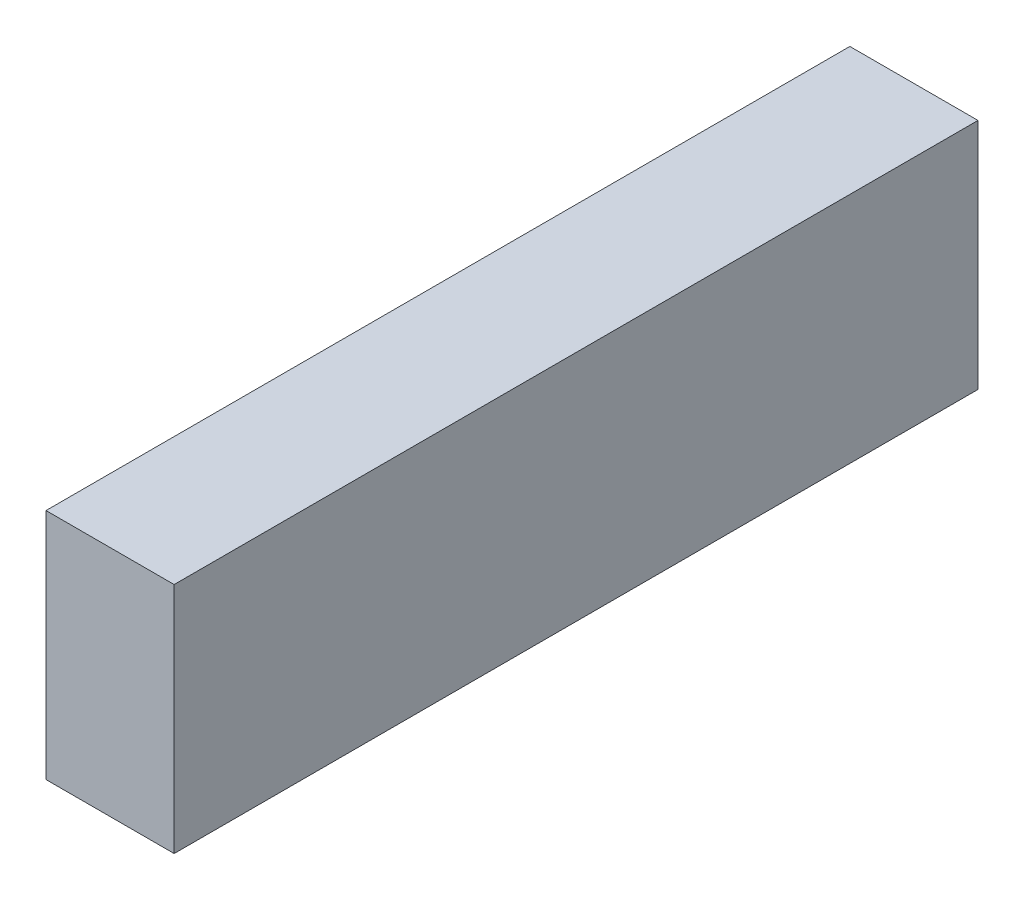
ISO-10303-21;
HEADER;
FILE_DESCRIPTION(('STEP AP214'),'2;1');
FILE_NAME('part.step','',(''),(''),'','','');
FILE_SCHEMA(('AUTOMOTIVE_DESIGN { 1 0 10303 214 1 1 1 1 }'));
ENDSEC;
DATA;
#1=APPLICATION_CONTEXT('core data for automotive mechanical design processes');
#2=APPLICATION_PROTOCOL_DEFINITION('international standard','automotive_design',2000,#1);
#3=PRODUCT_CONTEXT('',#1,'mechanical');
#4=PRODUCT('Part','Part','',(#3));
#5=PRODUCT_RELATED_PRODUCT_CATEGORY('part','',(#4));
#6=PRODUCT_DEFINITION_FORMATION('','',#4);
#7=PRODUCT_DEFINITION_CONTEXT('part definition',#1,'design');
#8=PRODUCT_DEFINITION('design','',#6,#7);
#9=PRODUCT_DEFINITION_SHAPE('','',#8);
#10=(LENGTH_UNIT() NAMED_UNIT(*) SI_UNIT(.MILLI.,.METRE.));
#11=(NAMED_UNIT(*) PLANE_ANGLE_UNIT() SI_UNIT($,.RADIAN.));
#12=(NAMED_UNIT(*) SI_UNIT($,.STERADIAN.) SOLID_ANGLE_UNIT());
#13=UNCERTAINTY_MEASURE_WITH_UNIT(LENGTH_MEASURE(1.E-05),#10,'distance_accuracy_value','');
#14=(GEOMETRIC_REPRESENTATION_CONTEXT(3) GLOBAL_UNCERTAINTY_ASSIGNED_CONTEXT((#13)) GLOBAL_UNIT_ASSIGNED_CONTEXT((#10,
#11,#12)) REPRESENTATION_CONTEXT('',''));
#15=CARTESIAN_POINT('',(0.,0.,0.));
#16=DIRECTION('',(0.,0.,1.));
#17=DIRECTION('',(1.,0.,0.));
#18=AXIS2_PLACEMENT_3D('',#15,#16,#17);
#19=CARTESIAN_POINT('',(11.,20.,138.));
#20=DIRECTION('',(-1.,0.,0.));
#21=DIRECTION('',(0.,-1.,0.));
#22=AXIS2_PLACEMENT_3D('',#19,#20,#21);
#23=PLANE('',#22);
#24=DIRECTION('',(0.,1.,0.));
#25=VECTOR('',#24,1.);
#26=CARTESIAN_POINT('',(11.,20.,0.));
#27=LINE('',#26,#25);
#28=CARTESIAN_POINT('',(11.,-20.,0.));
#29=VERTEX_POINT('',#28);
#30=CARTESIAN_POINT('',(11.,20.,0.));
#31=VERTEX_POINT('',#30);
#32=EDGE_CURVE('E99',#29,#31,#27,.T.);
#33=ORIENTED_EDGE('',*,*,#32,.T.);
#34=DIRECTION('',(0.,0.,-1.));
#35=VECTOR('',#34,1.);
#36=CARTESIAN_POINT('',(11.,20.,138.));
#37=LINE('',#36,#35);
#38=CARTESIAN_POINT('',(11.,20.,138.));
#39=VERTEX_POINT('',#38);
#40=EDGE_CURVE('E11',#39,#31,#37,.T.);
#41=ORIENTED_EDGE('',*,*,#40,.F.);
#42=DIRECTION('',(0.,1.,0.));
#43=VECTOR('',#42,1.);
#44=CARTESIAN_POINT('',(11.,20.,138.));
#45=LINE('',#44,#43);
#46=CARTESIAN_POINT('',(11.,-20.,138.));
#47=VERTEX_POINT('',#46);
#48=EDGE_CURVE('E87',#47,#39,#45,.T.);
#49=ORIENTED_EDGE('',*,*,#48,.F.);
#50=DIRECTION('',(0.,0.,-1.));
#51=VECTOR('',#50,1.);
#52=CARTESIAN_POINT('',(11.,-20.,138.));
#53=LINE('',#52,#51);
#54=EDGE_CURVE('E95',#47,#29,#53,.T.);
#55=ORIENTED_EDGE('',*,*,#54,.T.);
#56=EDGE_LOOP('',(#33,#41,#49,#55));
#57=FACE_BOUND('',#56,.T.);
#58=ADVANCED_FACE('F36',(#57),#23,.F.);
#59=CARTESIAN_POINT('',(-11.,20.,138.));
#60=DIRECTION('',(0.,-1.,0.));
#61=DIRECTION('',(0.,0.,-1.));
#62=AXIS2_PLACEMENT_3D('',#59,#60,#61);
#63=PLANE('',#62);
#64=DIRECTION('',(-1.,0.,0.));
#65=VECTOR('',#64,1.);
#66=CARTESIAN_POINT('',(-11.,20.,0.));
#67=LINE('',#66,#65);
#68=CARTESIAN_POINT('',(-11.,20.,0.));
#69=VERTEX_POINT('',#68);
#70=EDGE_CURVE('E91',#31,#69,#67,.T.);
#71=ORIENTED_EDGE('',*,*,#70,.T.);
#72=DIRECTION('',(0.,0.,-1.));
#73=VECTOR('',#72,1.);
#74=CARTESIAN_POINT('',(-11.,20.,138.));
#75=LINE('',#74,#73);
#76=CARTESIAN_POINT('',(-11.,20.,138.));
#77=VERTEX_POINT('',#76);
#78=EDGE_CURVE('E44',#77,#69,#75,.T.);
#79=ORIENTED_EDGE('',*,*,#78,.F.);
#80=DIRECTION('',(-1.,0.,0.));
#81=VECTOR('',#80,1.);
#82=CARTESIAN_POINT('',(-11.,20.,138.));
#83=LINE('',#82,#81);
#84=EDGE_CURVE('E82',#39,#77,#83,.T.);
#85=ORIENTED_EDGE('',*,*,#84,.F.);
#86=ORIENTED_EDGE('',*,*,#40,.T.);
#87=EDGE_LOOP('',(#71,#79,#85,#86));
#88=FACE_BOUND('',#87,.T.);
#89=ADVANCED_FACE('F90',(#88),#63,.F.);
#90=CARTESIAN_POINT('',(-11.,20.,138.));
#91=DIRECTION('',(1.,0.,0.));
#92=DIRECTION('',(0.,1.,0.));
#93=AXIS2_PLACEMENT_3D('',#90,#91,#92);
#94=PLANE('',#93);
#95=DIRECTION('',(0.,-1.,0.));
#96=VECTOR('',#95,1.);
#97=CARTESIAN_POINT('',(-11.,20.,0.));
#98=LINE('',#97,#96);
#99=CARTESIAN_POINT('',(-11.,-20.,0.));
#100=VERTEX_POINT('',#99);
#101=EDGE_CURVE('E69',#69,#100,#98,.T.);
#102=ORIENTED_EDGE('',*,*,#101,.T.);
#103=DIRECTION('',(0.,0.,-1.));
#104=VECTOR('',#103,1.);
#105=CARTESIAN_POINT('',(-11.,-20.,138.));
#106=LINE('',#105,#104);
#107=CARTESIAN_POINT('',(-11.,-20.,138.));
#108=VERTEX_POINT('',#107);
#109=EDGE_CURVE('E92',#108,#100,#106,.T.);
#110=ORIENTED_EDGE('',*,*,#109,.F.);
#111=DIRECTION('',(0.,-1.,0.));
#112=VECTOR('',#111,1.);
#113=CARTESIAN_POINT('',(-11.,20.,138.));
#114=LINE('',#113,#112);
#115=EDGE_CURVE('E85',#77,#108,#114,.T.);
#116=ORIENTED_EDGE('',*,*,#115,.F.);
#117=ORIENTED_EDGE('',*,*,#78,.T.);
#118=EDGE_LOOP('',(#102,#110,#116,#117));
#119=FACE_BOUND('',#118,.T.);
#120=ADVANCED_FACE('F93',(#119),#94,.F.);
#121=CARTESIAN_POINT('',(-11.,-20.,138.));
#122=DIRECTION('',(0.,1.,0.));
#123=DIRECTION('',(0.,0.,1.));
#124=AXIS2_PLACEMENT_3D('',#121,#122,#123);
#125=PLANE('',#124);
#126=DIRECTION('',(1.,0.,0.));
#127=VECTOR('',#126,1.);
#128=CARTESIAN_POINT('',(-11.,-20.,0.));
#129=LINE('',#128,#127);
#130=EDGE_CURVE('E75',#100,#29,#129,.T.);
#131=ORIENTED_EDGE('',*,*,#130,.T.);
#132=ORIENTED_EDGE('',*,*,#54,.F.);
#133=DIRECTION('',(1.,0.,0.));
#134=VECTOR('',#133,1.);
#135=CARTESIAN_POINT('',(-11.,-20.,138.));
#136=LINE('',#135,#134);
#137=EDGE_CURVE('E52',#108,#47,#136,.T.);
#138=ORIENTED_EDGE('',*,*,#137,.F.);
#139=ORIENTED_EDGE('',*,*,#109,.T.);
#140=EDGE_LOOP('',(#131,#132,#138,#139));
#141=FACE_BOUND('',#140,.T.);
#142=ADVANCED_FACE('F106',(#141),#125,.F.);
#143=CARTESIAN_POINT('',(0.,0.,138.));
#144=DIRECTION('',(0.,0.,1.));
#145=DIRECTION('',(1.,0.,0.));
#146=AXIS2_PLACEMENT_3D('',#143,#144,#145);
#147=PLANE('',#146);
#148=ORIENTED_EDGE('',*,*,#48,.T.);
#149=ORIENTED_EDGE('',*,*,#84,.T.);
#150=ORIENTED_EDGE('',*,*,#115,.T.);
#151=ORIENTED_EDGE('',*,*,#137,.T.);
#152=EDGE_LOOP('',(#148,#149,#150,#151));
#153=FACE_BOUND('',#152,.T.);
#154=ADVANCED_FACE('F83',(#153),#147,.T.);
#155=CARTESIAN_POINT('',(0.,0.,0.));
#156=DIRECTION('',(0.,0.,1.));
#157=DIRECTION('',(1.,0.,0.));
#158=AXIS2_PLACEMENT_3D('',#155,#156,#157);
#159=PLANE('',#158);
#160=ORIENTED_EDGE('',*,*,#32,.F.);
#161=ORIENTED_EDGE('',*,*,#130,.F.);
#162=ORIENTED_EDGE('',*,*,#101,.F.);
#163=ORIENTED_EDGE('',*,*,#70,.F.);
#164=EDGE_LOOP('',(#160,#161,#162,#163));
#165=FACE_BOUND('',#164,.T.);
#166=ADVANCED_FACE('F109',(#165),#159,.F.);
#167=CLOSED_SHELL('',(#58,#89,#120,#142,#154,#166));
#168=MANIFOLD_SOLID_BREP('B2',#167);
#169=ADVANCED_BREP_SHAPE_REPRESENTATION('',(#18,#168),#14);
#170=SHAPE_DEFINITION_REPRESENTATION(#9,#169);
ENDSEC;
END-ISO-10303-21;
